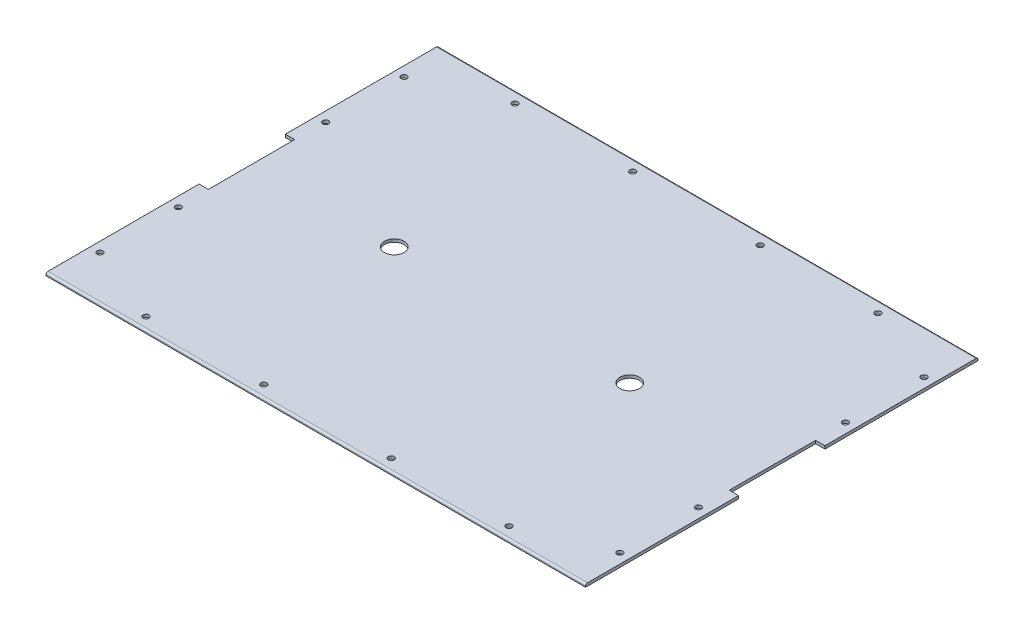
ISO-10303-21;
HEADER;
FILE_DESCRIPTION(('STEP AP214'),'2;1');
FILE_NAME('part.step','',(''),(''),'','','');
FILE_SCHEMA(('AUTOMOTIVE_DESIGN { 1 0 10303 214 1 1 1 1 }'));
ENDSEC;
DATA;
#1=APPLICATION_CONTEXT('core data for automotive mechanical design processes');
#2=APPLICATION_PROTOCOL_DEFINITION('international standard','automotive_design',2000,#1);
#3=PRODUCT_CONTEXT('',#1,'mechanical');
#4=PRODUCT('Part','Part','',(#3));
#5=PRODUCT_RELATED_PRODUCT_CATEGORY('part','',(#4));
#6=PRODUCT_DEFINITION_FORMATION('','',#4);
#7=PRODUCT_DEFINITION_CONTEXT('part definition',#1,'design');
#8=PRODUCT_DEFINITION('design','',#6,#7);
#9=PRODUCT_DEFINITION_SHAPE('','',#8);
#10=(LENGTH_UNIT() NAMED_UNIT(*) SI_UNIT(.MILLI.,.METRE.));
#11=(NAMED_UNIT(*) PLANE_ANGLE_UNIT() SI_UNIT($,.RADIAN.));
#12=(NAMED_UNIT(*) SI_UNIT($,.STERADIAN.) SOLID_ANGLE_UNIT());
#13=UNCERTAINTY_MEASURE_WITH_UNIT(LENGTH_MEASURE(1.E-05),#10,'distance_accuracy_value','');
#14=(GEOMETRIC_REPRESENTATION_CONTEXT(3) GLOBAL_UNCERTAINTY_ASSIGNED_CONTEXT((#13)) GLOBAL_UNIT_ASSIGNED_CONTEXT((#10,
#11,#12)) REPRESENTATION_CONTEXT('',''));
#15=CARTESIAN_POINT('',(0.,0.,0.));
#16=DIRECTION('',(0.,0.,1.));
#17=DIRECTION('',(1.,0.,0.));
#18=AXIS2_PLACEMENT_3D('',#15,#16,#17);
#19=CARTESIAN_POINT('',(0.,3.,-43.9999999999999));
#20=DIRECTION('',(0.,0.,1.));
#21=DIRECTION('',(1.,0.,0.));
#22=AXIS2_PLACEMENT_3D('',#19,#20,#21);
#23=PLANE('',#22);
#24=DIRECTION('',(-1.,0.,0.));
#25=VECTOR('',#24,1.);
#26=CARTESIAN_POINT('',(0.,0.,-43.9999999999999));
#27=LINE('',#26,#25);
#28=CARTESIAN_POINT('',(275.,0.,-43.9999999999999));
#29=VERTEX_POINT('',#28);
#30=CARTESIAN_POINT('',(265.5,0.,-43.9999999999999));
#31=VERTEX_POINT('',#30);
#32=EDGE_CURVE('E145',#29,#31,#27,.T.);
#33=ORIENTED_EDGE('',*,*,#32,.F.);
#34=DIRECTION('',(0.,-1.,0.));
#35=VECTOR('',#34,1.);
#36=CARTESIAN_POINT('',(275.,3.,-43.9999999999999));
#37=LINE('',#36,#35);
#38=CARTESIAN_POINT('',(275.,3.,-43.9999999999999));
#39=VERTEX_POINT('',#38);
#40=EDGE_CURVE('E140',#39,#29,#37,.T.);
#41=ORIENTED_EDGE('',*,*,#40,.F.);
#42=DIRECTION('',(-1.,0.,0.));
#43=VECTOR('',#42,1.);
#44=CARTESIAN_POINT('',(0.,3.,-43.9999999999999));
#45=LINE('',#44,#43);
#46=CARTESIAN_POINT('',(265.5,3.,-43.9999999999999));
#47=VERTEX_POINT('',#46);
#48=EDGE_CURVE('E142',#39,#47,#45,.T.);
#49=ORIENTED_EDGE('',*,*,#48,.T.);
#50=DIRECTION('',(0.,-1.,0.));
#51=VECTOR('',#50,1.);
#52=CARTESIAN_POINT('',(265.5,3.,-43.9999999999999));
#53=LINE('',#52,#51);
#54=EDGE_CURVE('E197',#47,#31,#53,.T.);
#55=ORIENTED_EDGE('',*,*,#54,.T.);
#56=EDGE_LOOP('',(#33,#41,#49,#55));
#57=FACE_BOUND('',#56,.T.);
#58=ADVANCED_FACE('F39',(#57),#23,.T.);
#59=CARTESIAN_POINT('',(275.,3.,1.95712392161486E-13));
#60=DIRECTION('',(-1.,0.,0.));
#61=DIRECTION('',(0.,0.,1.));
#62=AXIS2_PLACEMENT_3D('',#59,#60,#61);
#63=PLANE('',#62);
#64=DIRECTION('',(0.,-1.,0.));
#65=VECTOR('',#64,1.);
#66=CARTESIAN_POINT('',(275.,3.,-200.));
#67=LINE('',#66,#65);
#68=CARTESIAN_POINT('',(275.,1.,-200.));
#69=VERTEX_POINT('',#68);
#70=CARTESIAN_POINT('',(275.,0.,-200.));
#71=VERTEX_POINT('',#70);
#72=EDGE_CURVE('E149',#69,#71,#67,.T.);
#73=ORIENTED_EDGE('',*,*,#72,.F.);
#74=CARTESIAN_POINT('',(275.,1.,-198.));
#75=DIRECTION('',(-1.,0.,0.));
#76=DIRECTION('',(0.,0.,1.));
#77=AXIS2_PLACEMENT_3D('',#74,#75,#76);
#78=CIRCLE('',#77,2.);
#79=CARTESIAN_POINT('',(275.,3.,-198.));
#80=VERTEX_POINT('',#79);
#81=EDGE_CURVE('E61',#69,#80,#78,.F.);
#82=ORIENTED_EDGE('',*,*,#81,.T.);
#83=DIRECTION('',(0.,0.,-1.));
#84=VECTOR('',#83,1.);
#85=CARTESIAN_POINT('',(275.,3.,1.95712392161486E-13));
#86=LINE('',#85,#84);
#87=EDGE_CURVE('E151',#39,#80,#86,.T.);
#88=ORIENTED_EDGE('',*,*,#87,.F.);
#89=ORIENTED_EDGE('',*,*,#40,.T.);
#90=DIRECTION('',(0.,0.,-1.));
#91=VECTOR('',#90,1.);
#92=CARTESIAN_POINT('',(275.,0.,1.95712392161486E-13));
#93=LINE('',#92,#91);
#94=EDGE_CURVE('E241',#29,#71,#93,.T.);
#95=ORIENTED_EDGE('',*,*,#94,.T.);
#96=EDGE_LOOP('',(#73,#82,#88,#89,#95));
#97=FACE_BOUND('',#96,.T.);
#98=ADVANCED_FACE('F152',(#97),#63,.F.);
#99=CARTESIAN_POINT('',(0.,3.,-200.));
#100=DIRECTION('',(0.,0.,-1.));
#101=DIRECTION('',(-1.,0.,0.));
#102=AXIS2_PLACEMENT_3D('',#99,#100,#101);
#103=PLANE('',#102);
#104=DIRECTION('',(0.,-1.,0.));
#105=VECTOR('',#104,1.);
#106=CARTESIAN_POINT('',(-275.,3.,-200.));
#107=LINE('',#106,#105);
#108=CARTESIAN_POINT('',(-275.,1.,-200.));
#109=VERTEX_POINT('',#108);
#110=CARTESIAN_POINT('',(-275.,0.,-200.));
#111=VERTEX_POINT('',#110);
#112=EDGE_CURVE('E305',#109,#111,#107,.T.);
#113=ORIENTED_EDGE('',*,*,#112,.F.);
#114=DIRECTION('',(1.,0.,0.));
#115=VECTOR('',#114,1.);
#116=CARTESIAN_POINT('',(0.,1.,-200.));
#117=LINE('',#116,#115);
#118=EDGE_CURVE('E316',#109,#69,#117,.T.);
#119=ORIENTED_EDGE('',*,*,#118,.T.);
#120=ORIENTED_EDGE('',*,*,#72,.T.);
#121=DIRECTION('',(1.,0.,0.));
#122=VECTOR('',#121,1.);
#123=CARTESIAN_POINT('',(0.,0.,-200.));
#124=LINE('',#123,#122);
#125=EDGE_CURVE('E243',#111,#71,#124,.T.);
#126=ORIENTED_EDGE('',*,*,#125,.F.);
#127=EDGE_LOOP('',(#113,#119,#120,#126));
#128=FACE_BOUND('',#127,.T.);
#129=ADVANCED_FACE('F322',(#128),#103,.T.);
#130=CARTESIAN_POINT('',(-275.,3.,0.));
#131=DIRECTION('',(-1.,0.,0.));
#132=DIRECTION('',(0.,0.,1.));
#133=AXIS2_PLACEMENT_3D('',#130,#131,#132);
#134=PLANE('',#133);
#135=DIRECTION('',(0.,0.,-1.));
#136=VECTOR('',#135,1.);
#137=CARTESIAN_POINT('',(-275.,3.,0.));
#138=LINE('',#137,#136);
#139=CARTESIAN_POINT('',(-275.,3.,-43.9999999999999));
#140=VERTEX_POINT('',#139);
#141=CARTESIAN_POINT('',(-275.,3.,-198.));
#142=VERTEX_POINT('',#141);
#143=EDGE_CURVE('E153',#140,#142,#138,.T.);
#144=ORIENTED_EDGE('',*,*,#143,.T.);
#145=CARTESIAN_POINT('',(-275.,1.,-198.));
#146=DIRECTION('',(-1.,0.,0.));
#147=DIRECTION('',(0.,0.,1.));
#148=AXIS2_PLACEMENT_3D('',#145,#146,#147);
#149=CIRCLE('',#148,2.);
#150=EDGE_CURVE('E11',#142,#109,#149,.T.);
#151=ORIENTED_EDGE('',*,*,#150,.T.);
#152=ORIENTED_EDGE('',*,*,#112,.T.);
#153=DIRECTION('',(0.,0.,-1.));
#154=VECTOR('',#153,1.);
#155=CARTESIAN_POINT('',(-275.,0.,0.));
#156=LINE('',#155,#154);
#157=CARTESIAN_POINT('',(-275.,0.,-43.9999999999999));
#158=VERTEX_POINT('',#157);
#159=EDGE_CURVE('E246',#158,#111,#156,.T.);
#160=ORIENTED_EDGE('',*,*,#159,.F.);
#161=DIRECTION('',(0.,-1.,0.));
#162=VECTOR('',#161,1.);
#163=CARTESIAN_POINT('',(-275.,3.,-43.9999999999999));
#164=LINE('',#163,#162);
#165=EDGE_CURVE('E303',#140,#158,#164,.T.);
#166=ORIENTED_EDGE('',*,*,#165,.F.);
#167=EDGE_LOOP('',(#144,#151,#152,#160,#166));
#168=FACE_BOUND('',#167,.T.);
#169=ADVANCED_FACE('F332',(#168),#134,.T.);
#170=CARTESIAN_POINT('',(0.,3.,-43.9999999999999));
#171=DIRECTION('',(0.,0.,-1.));
#172=DIRECTION('',(-1.,0.,0.));
#173=AXIS2_PLACEMENT_3D('',#170,#171,#172);
#174=PLANE('',#173);
#175=DIRECTION('',(1.,0.,0.));
#176=VECTOR('',#175,1.);
#177=CARTESIAN_POINT('',(0.,0.,-43.9999999999999));
#178=LINE('',#177,#176);
#179=CARTESIAN_POINT('',(-265.5,0.,-43.9999999999999));
#180=VERTEX_POINT('',#179);
#181=EDGE_CURVE('E249',#158,#180,#178,.T.);
#182=ORIENTED_EDGE('',*,*,#181,.T.);
#183=DIRECTION('',(0.,-1.,0.));
#184=VECTOR('',#183,1.);
#185=CARTESIAN_POINT('',(-265.5,3.,-43.9999999999999));
#186=LINE('',#185,#184);
#187=CARTESIAN_POINT('',(-265.5,3.,-43.9999999999999));
#188=VERTEX_POINT('',#187);
#189=EDGE_CURVE('E300',#188,#180,#186,.T.);
#190=ORIENTED_EDGE('',*,*,#189,.F.);
#191=DIRECTION('',(1.,0.,0.));
#192=VECTOR('',#191,1.);
#193=CARTESIAN_POINT('',(0.,3.,-43.9999999999999));
#194=LINE('',#193,#192);
#195=EDGE_CURVE('E168',#140,#188,#194,.T.);
#196=ORIENTED_EDGE('',*,*,#195,.F.);
#197=ORIENTED_EDGE('',*,*,#165,.T.);
#198=EDGE_LOOP('',(#182,#190,#196,#197));
#199=FACE_BOUND('',#198,.T.);
#200=ADVANCED_FACE('F500',(#199),#174,.F.);
#201=CARTESIAN_POINT('',(-265.5,3.,1.67479666498852E-13));
#202=DIRECTION('',(1.,0.,0.));
#203=DIRECTION('',(0.,0.,-1.));
#204=AXIS2_PLACEMENT_3D('',#201,#202,#203);
#205=PLANE('',#204);
#206=DIRECTION('',(0.,0.,1.));
#207=VECTOR('',#206,1.);
#208=CARTESIAN_POINT('',(-265.5,0.,1.67479666498852E-13));
#209=LINE('',#208,#207);
#210=CARTESIAN_POINT('',(-265.5,0.,44.0000000000001));
#211=VERTEX_POINT('',#210);
#212=EDGE_CURVE('E252',#180,#211,#209,.T.);
#213=ORIENTED_EDGE('',*,*,#212,.T.);
#214=DIRECTION('',(0.,-1.,0.));
#215=VECTOR('',#214,1.);
#216=CARTESIAN_POINT('',(-265.5,3.,44.0000000000001));
#217=LINE('',#216,#215);
#218=CARTESIAN_POINT('',(-265.5,3.,44.0000000000001));
#219=VERTEX_POINT('',#218);
#220=EDGE_CURVE('E297',#219,#211,#217,.T.);
#221=ORIENTED_EDGE('',*,*,#220,.F.);
#222=DIRECTION('',(0.,0.,1.));
#223=VECTOR('',#222,1.);
#224=CARTESIAN_POINT('',(-265.5,3.,1.67479666498852E-13));
#225=LINE('',#224,#223);
#226=EDGE_CURVE('E171',#188,#219,#225,.T.);
#227=ORIENTED_EDGE('',*,*,#226,.F.);
#228=ORIENTED_EDGE('',*,*,#189,.T.);
#229=EDGE_LOOP('',(#213,#221,#227,#228));
#230=FACE_BOUND('',#229,.T.);
#231=ADVANCED_FACE('F496',(#230),#205,.F.);
#232=CARTESIAN_POINT('',(0.,3.,44.0000000000001));
#233=DIRECTION('',(0.,0.,1.));
#234=DIRECTION('',(1.,0.,0.));
#235=AXIS2_PLACEMENT_3D('',#232,#233,#234);
#236=PLANE('',#235);
#237=DIRECTION('',(-1.,0.,0.));
#238=VECTOR('',#237,1.);
#239=CARTESIAN_POINT('',(0.,0.,44.0000000000001));
#240=LINE('',#239,#238);
#241=CARTESIAN_POINT('',(-275.,0.,44.0000000000001));
#242=VERTEX_POINT('',#241);
#243=EDGE_CURVE('E255',#211,#242,#240,.T.);
#244=ORIENTED_EDGE('',*,*,#243,.T.);
#245=DIRECTION('',(0.,-1.,0.));
#246=VECTOR('',#245,1.);
#247=CARTESIAN_POINT('',(-275.,3.,44.0000000000001));
#248=LINE('',#247,#246);
#249=CARTESIAN_POINT('',(-275.,3.,44.0000000000001));
#250=VERTEX_POINT('',#249);
#251=EDGE_CURVE('E295',#250,#242,#248,.T.);
#252=ORIENTED_EDGE('',*,*,#251,.F.);
#253=DIRECTION('',(-1.,0.,0.));
#254=VECTOR('',#253,1.);
#255=CARTESIAN_POINT('',(0.,3.,44.0000000000001));
#256=LINE('',#255,#254);
#257=EDGE_CURVE('E174',#219,#250,#256,.T.);
#258=ORIENTED_EDGE('',*,*,#257,.F.);
#259=ORIENTED_EDGE('',*,*,#220,.T.);
#260=EDGE_LOOP('',(#244,#252,#258,#259));
#261=FACE_BOUND('',#260,.T.);
#262=ADVANCED_FACE('F492',(#261),#236,.F.);
#263=CARTESIAN_POINT('',(-275.,3.,0.));
#264=DIRECTION('',(-1.,0.,0.));
#265=DIRECTION('',(0.,0.,1.));
#266=AXIS2_PLACEMENT_3D('',#263,#264,#265);
#267=PLANE('',#266);
#268=DIRECTION('',(0.,-1.,0.));
#269=VECTOR('',#268,1.);
#270=CARTESIAN_POINT('',(-275.,3.,200.));
#271=LINE('',#270,#269);
#272=CARTESIAN_POINT('',(-275.,1.,200.));
#273=VERTEX_POINT('',#272);
#274=CARTESIAN_POINT('',(-275.,0.,200.));
#275=VERTEX_POINT('',#274);
#276=EDGE_CURVE('E293',#273,#275,#271,.T.);
#277=ORIENTED_EDGE('',*,*,#276,.F.);
#278=CARTESIAN_POINT('',(-275.,1.,198.));
#279=DIRECTION('',(-1.,0.,0.));
#280=DIRECTION('',(0.,0.,1.));
#281=AXIS2_PLACEMENT_3D('',#278,#279,#280);
#282=CIRCLE('',#281,2.);
#283=CARTESIAN_POINT('',(-275.,3.,198.));
#284=VERTEX_POINT('',#283);
#285=EDGE_CURVE('E314',#273,#284,#282,.T.);
#286=ORIENTED_EDGE('',*,*,#285,.T.);
#287=DIRECTION('',(0.,0.,-1.));
#288=VECTOR('',#287,1.);
#289=CARTESIAN_POINT('',(-275.,3.,0.));
#290=LINE('',#289,#288);
#291=EDGE_CURVE('E177',#284,#250,#290,.T.);
#292=ORIENTED_EDGE('',*,*,#291,.T.);
#293=ORIENTED_EDGE('',*,*,#251,.T.);
#294=DIRECTION('',(0.,0.,-1.));
#295=VECTOR('',#294,1.);
#296=CARTESIAN_POINT('',(-275.,0.,0.));
#297=LINE('',#296,#295);
#298=EDGE_CURVE('E258',#275,#242,#297,.T.);
#299=ORIENTED_EDGE('',*,*,#298,.F.);
#300=EDGE_LOOP('',(#277,#286,#292,#293,#299));
#301=FACE_BOUND('',#300,.T.);
#302=ADVANCED_FACE('F488',(#301),#267,.T.);
#303=CARTESIAN_POINT('',(0.,3.,200.));
#304=DIRECTION('',(0.,0.,-1.));
#305=DIRECTION('',(-1.,0.,0.));
#306=AXIS2_PLACEMENT_3D('',#303,#304,#305);
#307=PLANE('',#306);
#308=DIRECTION('',(0.,-1.,0.));
#309=VECTOR('',#308,1.);
#310=CARTESIAN_POINT('',(275.,3.,200.));
#311=LINE('',#310,#309);
#312=CARTESIAN_POINT('',(275.,1.,200.));
#313=VERTEX_POINT('',#312);
#314=CARTESIAN_POINT('',(275.,0.,200.));
#315=VERTEX_POINT('',#314);
#316=EDGE_CURVE('E291',#313,#315,#311,.T.);
#317=ORIENTED_EDGE('',*,*,#316,.F.);
#318=DIRECTION('',(1.,0.,0.));
#319=VECTOR('',#318,1.);
#320=CARTESIAN_POINT('',(-275.,1.,200.));
#321=LINE('',#320,#319);
#322=EDGE_CURVE('E312',#313,#273,#321,.F.);
#323=ORIENTED_EDGE('',*,*,#322,.T.);
#324=ORIENTED_EDGE('',*,*,#276,.T.);
#325=DIRECTION('',(1.,0.,0.));
#326=VECTOR('',#325,1.);
#327=CARTESIAN_POINT('',(0.,0.,200.));
#328=LINE('',#327,#326);
#329=EDGE_CURVE('E261',#275,#315,#328,.T.);
#330=ORIENTED_EDGE('',*,*,#329,.T.);
#331=EDGE_LOOP('',(#317,#323,#324,#330));
#332=FACE_BOUND('',#331,.T.);
#333=ADVANCED_FACE('F484',(#332),#307,.F.);
#334=CARTESIAN_POINT('',(275.,3.,-1.95712392161486E-13));
#335=DIRECTION('',(-1.,0.,0.));
#336=DIRECTION('',(0.,0.,1.));
#337=AXIS2_PLACEMENT_3D('',#334,#335,#336);
#338=PLANE('',#337);
#339=DIRECTION('',(0.,0.,-1.));
#340=VECTOR('',#339,1.);
#341=CARTESIAN_POINT('',(275.,3.,-1.95712392161486E-13));
#342=LINE('',#341,#340);
#343=CARTESIAN_POINT('',(275.,3.,198.));
#344=VERTEX_POINT('',#343);
#345=CARTESIAN_POINT('',(275.,3.,44.0000000000001));
#346=VERTEX_POINT('',#345);
#347=EDGE_CURVE('E179',#344,#346,#342,.T.);
#348=ORIENTED_EDGE('',*,*,#347,.F.);
#349=CARTESIAN_POINT('',(275.,1.,198.));
#350=DIRECTION('',(-1.,0.,0.));
#351=DIRECTION('',(0.,0.,1.));
#352=AXIS2_PLACEMENT_3D('',#349,#350,#351);
#353=CIRCLE('',#352,2.);
#354=EDGE_CURVE('E310',#344,#313,#353,.F.);
#355=ORIENTED_EDGE('',*,*,#354,.T.);
#356=ORIENTED_EDGE('',*,*,#316,.T.);
#357=DIRECTION('',(0.,0.,-1.));
#358=VECTOR('',#357,1.);
#359=CARTESIAN_POINT('',(275.,0.,-1.95712392161486E-13));
#360=LINE('',#359,#358);
#361=CARTESIAN_POINT('',(275.,0.,44.0000000000001));
#362=VERTEX_POINT('',#361);
#363=EDGE_CURVE('E264',#315,#362,#360,.T.);
#364=ORIENTED_EDGE('',*,*,#363,.T.);
#365=DIRECTION('',(0.,-1.,0.));
#366=VECTOR('',#365,1.);
#367=CARTESIAN_POINT('',(275.,3.,44.0000000000001));
#368=LINE('',#367,#366);
#369=EDGE_CURVE('E289',#346,#362,#368,.T.);
#370=ORIENTED_EDGE('',*,*,#369,.F.);
#371=EDGE_LOOP('',(#348,#355,#356,#364,#370));
#372=FACE_BOUND('',#371,.T.);
#373=ADVANCED_FACE('F480',(#372),#338,.F.);
#374=CARTESIAN_POINT('',(0.,3.,44.0000000000001));
#375=DIRECTION('',(0.,0.,-1.));
#376=DIRECTION('',(-1.,0.,0.));
#377=AXIS2_PLACEMENT_3D('',#374,#375,#376);
#378=PLANE('',#377);
#379=DIRECTION('',(1.,0.,0.));
#380=VECTOR('',#379,1.);
#381=CARTESIAN_POINT('',(0.,0.,44.0000000000001));
#382=LINE('',#381,#380);
#383=CARTESIAN_POINT('',(265.5,0.,44.0000000000001));
#384=VERTEX_POINT('',#383);
#385=EDGE_CURVE('E267',#384,#362,#382,.T.);
#386=ORIENTED_EDGE('',*,*,#385,.F.);
#387=DIRECTION('',(0.,-1.,0.));
#388=VECTOR('',#387,1.);
#389=CARTESIAN_POINT('',(265.5,3.,44.0000000000001));
#390=LINE('',#389,#388);
#391=CARTESIAN_POINT('',(265.5,3.,44.0000000000001));
#392=VERTEX_POINT('',#391);
#393=EDGE_CURVE('E287',#392,#384,#390,.T.);
#394=ORIENTED_EDGE('',*,*,#393,.F.);
#395=DIRECTION('',(1.,0.,0.));
#396=VECTOR('',#395,1.);
#397=CARTESIAN_POINT('',(0.,3.,44.0000000000001));
#398=LINE('',#397,#396);
#399=EDGE_CURVE('E181',#392,#346,#398,.T.);
#400=ORIENTED_EDGE('',*,*,#399,.T.);
#401=ORIENTED_EDGE('',*,*,#369,.T.);
#402=EDGE_LOOP('',(#386,#394,#400,#401));
#403=FACE_BOUND('',#402,.T.);
#404=ADVANCED_FACE('F466',(#403),#378,.T.);
#405=CARTESIAN_POINT('',(185.,3.,188.));
#406=DIRECTION('',(0.,-1.,0.));
#407=DIRECTION('',(0.,0.,-1.));
#408=AXIS2_PLACEMENT_3D('',#405,#406,#407);
#409=CYLINDRICAL_SURFACE('',#408,2.99999999999999);
#410=CARTESIAN_POINT('',(185.,3.,188.));
#411=DIRECTION('',(0.,1.,0.));
#412=DIRECTION('',(0.,0.,1.));
#413=AXIS2_PLACEMENT_3D('',#410,#411,#412);
#414=CIRCLE('',#413,2.99999999999999);
#415=CARTESIAN_POINT('',(185.,3.,191.));
#416=VERTEX_POINT('',#415);
#417=EDGE_CURVE('E191',#416,#416,#414,.F.);
#418=ORIENTED_EDGE('',*,*,#417,.F.);
#419=EDGE_LOOP('',(#418));
#420=FACE_BOUND('',#419,.T.);
#421=CARTESIAN_POINT('',(185.,0.,188.));
#422=DIRECTION('',(0.,1.,0.));
#423=DIRECTION('',(0.,0.,1.));
#424=AXIS2_PLACEMENT_3D('',#421,#422,#423);
#425=CIRCLE('',#424,2.99999999999999);
#426=CARTESIAN_POINT('',(185.,0.,191.));
#427=VERTEX_POINT('',#426);
#428=EDGE_CURVE('E279',#427,#427,#425,.F.);
#429=ORIENTED_EDGE('',*,*,#428,.T.);
#430=EDGE_LOOP('',(#429));
#431=FACE_BOUND('',#430,.T.);
#432=ADVANCED_FACE('F462',(#420,#431),#409,.F.);
#433=CARTESIAN_POINT('',(-265.,3.,-75.));
#434=DIRECTION('',(0.,-1.,0.));
#435=DIRECTION('',(0.,0.,-1.));
#436=AXIS2_PLACEMENT_3D('',#433,#434,#435);
#437=CYLINDRICAL_SURFACE('',#436,2.99999999999999);
#438=CARTESIAN_POINT('',(-265.,3.,-75.));
#439=DIRECTION('',(0.,1.,0.));
#440=DIRECTION('',(0.,0.,1.));
#441=AXIS2_PLACEMENT_3D('',#438,#439,#440);
#442=CIRCLE('',#441,2.99999999999999);
#443=CARTESIAN_POINT('',(-265.,3.,-72.));
#444=VERTEX_POINT('',#443);
#445=EDGE_CURVE('E188',#444,#444,#442,.F.);
#446=ORIENTED_EDGE('',*,*,#445,.F.);
#447=EDGE_LOOP('',(#446));
#448=FACE_BOUND('',#447,.T.);
#449=CARTESIAN_POINT('',(-265.,0.,-75.));
#450=DIRECTION('',(0.,1.,0.));
#451=DIRECTION('',(0.,0.,1.));
#452=AXIS2_PLACEMENT_3D('',#449,#450,#451);
#453=CIRCLE('',#452,2.99999999999999);
#454=CARTESIAN_POINT('',(-265.,0.,-72.));
#455=VERTEX_POINT('',#454);
#456=EDGE_CURVE('E276',#455,#455,#453,.F.);
#457=ORIENTED_EDGE('',*,*,#456,.T.);
#458=EDGE_LOOP('',(#457));
#459=FACE_BOUND('',#458,.T.);
#460=ADVANCED_FACE('F465',(#448,#459),#437,.F.);
#461=CARTESIAN_POINT('',(-185.,3.,-188.));
#462=DIRECTION('',(0.,-1.,0.));
#463=DIRECTION('',(0.,0.,-1.));
#464=AXIS2_PLACEMENT_3D('',#461,#462,#463);
#465=CYLINDRICAL_SURFACE('',#464,2.99999999999999);
#466=CARTESIAN_POINT('',(-185.,3.,-188.));
#467=DIRECTION('',(0.,1.,0.));
#468=DIRECTION('',(0.,0.,1.));
#469=AXIS2_PLACEMENT_3D('',#466,#467,#468);
#470=CIRCLE('',#469,2.99999999999999);
#471=CARTESIAN_POINT('',(-185.,3.,-185.));
#472=VERTEX_POINT('',#471);
#473=EDGE_CURVE('E185',#472,#472,#470,.F.);
#474=ORIENTED_EDGE('',*,*,#473,.F.);
#475=EDGE_LOOP('',(#474));
#476=FACE_BOUND('',#475,.T.);
#477=CARTESIAN_POINT('',(-185.,0.,-188.));
#478=DIRECTION('',(0.,1.,0.));
#479=DIRECTION('',(0.,0.,1.));
#480=AXIS2_PLACEMENT_3D('',#477,#478,#479);
#481=CIRCLE('',#480,2.99999999999999);
#482=CARTESIAN_POINT('',(-185.,0.,-185.));
#483=VERTEX_POINT('',#482);
#484=EDGE_CURVE('E273',#483,#483,#481,.F.);
#485=ORIENTED_EDGE('',*,*,#484,.T.);
#486=EDGE_LOOP('',(#485));
#487=FACE_BOUND('',#486,.T.);
#488=ADVANCED_FACE('F470',(#476,#487),#465,.F.);
#489=CARTESIAN_POINT('',(265.5,3.,1.67479666498852E-13));
#490=DIRECTION('',(1.,0.,0.));
#491=DIRECTION('',(0.,0.,-1.));
#492=AXIS2_PLACEMENT_3D('',#489,#490,#491);
#493=PLANE('',#492);
#494=DIRECTION('',(0.,0.,1.));
#495=VECTOR('',#494,1.);
#496=CARTESIAN_POINT('',(265.5,0.,1.67479666498852E-13));
#497=LINE('',#496,#495);
#498=EDGE_CURVE('E270',#31,#384,#497,.T.);
#499=ORIENTED_EDGE('',*,*,#498,.F.);
#500=ORIENTED_EDGE('',*,*,#54,.F.);
#501=DIRECTION('',(0.,0.,1.));
#502=VECTOR('',#501,1.);
#503=CARTESIAN_POINT('',(265.5,3.,1.67479666498852E-13));
#504=LINE('',#503,#502);
#505=EDGE_CURVE('E159',#47,#392,#504,.T.);
#506=ORIENTED_EDGE('',*,*,#505,.T.);
#507=ORIENTED_EDGE('',*,*,#393,.T.);
#508=EDGE_LOOP('',(#499,#500,#506,#507));
#509=FACE_BOUND('',#508,.T.);
#510=ADVANCED_FACE('F352',(#509),#493,.T.);
#511=CARTESIAN_POINT('',(-265.,3.,75.));
#512=DIRECTION('',(0.,-1.,0.));
#513=DIRECTION('',(0.,0.,-1.));
#514=AXIS2_PLACEMENT_3D('',#511,#512,#513);
#515=CYLINDRICAL_SURFACE('',#514,2.99999999999999);
#516=CARTESIAN_POINT('',(-265.,3.,75.));
#517=DIRECTION('',(0.,1.,0.));
#518=DIRECTION('',(0.,0.,1.));
#519=AXIS2_PLACEMENT_3D('',#516,#517,#518);
#520=CIRCLE('',#519,2.99999999999999);
#521=CARTESIAN_POINT('',(-265.,3.,78.));
#522=VERTEX_POINT('',#521);
#523=EDGE_CURVE('E160',#522,#522,#520,.T.);
#524=ORIENTED_EDGE('',*,*,#523,.T.);
#525=EDGE_LOOP('',(#524));
#526=FACE_BOUND('',#525,.T.);
#527=CARTESIAN_POINT('',(-265.,0.,75.));
#528=DIRECTION('',(0.,1.,0.));
#529=DIRECTION('',(0.,0.,1.));
#530=AXIS2_PLACEMENT_3D('',#527,#528,#529);
#531=CIRCLE('',#530,2.99999999999999);
#532=CARTESIAN_POINT('',(-265.,0.,78.));
#533=VERTEX_POINT('',#532);
#534=EDGE_CURVE('E237',#533,#533,#531,.T.);
#535=ORIENTED_EDGE('',*,*,#534,.F.);
#536=EDGE_LOOP('',(#535));
#537=FACE_BOUND('',#536,.T.);
#538=ADVANCED_FACE('F348',(#526,#537),#515,.F.);
#539=CARTESIAN_POINT('',(-265.,3.,155.));
#540=DIRECTION('',(0.,-1.,0.));
#541=DIRECTION('',(0.,0.,-1.));
#542=AXIS2_PLACEMENT_3D('',#539,#540,#541);
#543=CYLINDRICAL_SURFACE('',#542,2.99999999999999);
#544=CARTESIAN_POINT('',(-265.,3.,155.));
#545=DIRECTION('',(0.,1.,0.));
#546=DIRECTION('',(0.,0.,1.));
#547=AXIS2_PLACEMENT_3D('',#544,#545,#546);
#548=CIRCLE('',#547,2.99999999999999);
#549=CARTESIAN_POINT('',(-265.,3.,158.));
#550=VERTEX_POINT('',#549);
#551=EDGE_CURVE('E163',#550,#550,#548,.T.);
#552=ORIENTED_EDGE('',*,*,#551,.T.);
#553=EDGE_LOOP('',(#552));
#554=FACE_BOUND('',#553,.T.);
#555=CARTESIAN_POINT('',(-265.,0.,155.));
#556=DIRECTION('',(0.,1.,0.));
#557=DIRECTION('',(0.,0.,1.));
#558=AXIS2_PLACEMENT_3D('',#555,#556,#557);
#559=CIRCLE('',#558,2.99999999999999);
#560=CARTESIAN_POINT('',(-265.,0.,158.));
#561=VERTEX_POINT('',#560);
#562=EDGE_CURVE('E234',#561,#561,#559,.T.);
#563=ORIENTED_EDGE('',*,*,#562,.F.);
#564=EDGE_LOOP('',(#563));
#565=FACE_BOUND('',#564,.T.);
#566=ADVANCED_FACE('F351',(#554,#565),#543,.F.);
#567=CARTESIAN_POINT('',(-185.,3.,188.));
#568=DIRECTION('',(0.,-1.,0.));
#569=DIRECTION('',(0.,0.,-1.));
#570=AXIS2_PLACEMENT_3D('',#567,#568,#569);
#571=CYLINDRICAL_SURFACE('',#570,2.99999999999999);
#572=CARTESIAN_POINT('',(-185.,3.,188.));
#573=DIRECTION('',(0.,1.,0.));
#574=DIRECTION('',(0.,0.,1.));
#575=AXIS2_PLACEMENT_3D('',#572,#573,#574);
#576=CIRCLE('',#575,2.99999999999999);
#577=CARTESIAN_POINT('',(-185.,3.,191.));
#578=VERTEX_POINT('',#577);
#579=EDGE_CURVE('E835',#578,#578,#576,.T.);
#580=ORIENTED_EDGE('',*,*,#579,.T.);
#581=EDGE_LOOP('',(#580));
#582=FACE_BOUND('',#581,.T.);
#583=CARTESIAN_POINT('',(-185.,0.,188.));
#584=DIRECTION('',(0.,1.,0.));
#585=DIRECTION('',(0.,0.,1.));
#586=AXIS2_PLACEMENT_3D('',#583,#584,#585);
#587=CIRCLE('',#586,2.99999999999999);
#588=CARTESIAN_POINT('',(-185.,0.,191.));
#589=VERTEX_POINT('',#588);
#590=EDGE_CURVE('E231',#589,#589,#587,.T.);
#591=ORIENTED_EDGE('',*,*,#590,.F.);
#592=EDGE_LOOP('',(#591));
#593=FACE_BOUND('',#592,.T.);
#594=ADVANCED_FACE('F356',(#582,#593),#571,.F.);
#595=CARTESIAN_POINT('',(-65.0000000000001,3.,188.));
#596=DIRECTION('',(0.,-1.,0.));
#597=DIRECTION('',(0.,0.,-1.));
#598=AXIS2_PLACEMENT_3D('',#595,#596,#597);
#599=CYLINDRICAL_SURFACE('',#598,3.);
#600=CARTESIAN_POINT('',(-65.0000000000001,3.,188.));
#601=DIRECTION('',(0.,1.,0.));
#602=DIRECTION('',(0.,0.,1.));
#603=AXIS2_PLACEMENT_3D('',#600,#601,#602);
#604=CIRCLE('',#603,3.);
#605=CARTESIAN_POINT('',(-65.0000000000001,3.,191.));
#606=VERTEX_POINT('',#605);
#607=EDGE_CURVE('E831',#606,#606,#604,.T.);
#608=ORIENTED_EDGE('',*,*,#607,.T.);
#609=EDGE_LOOP('',(#608));
#610=FACE_BOUND('',#609,.T.);
#611=CARTESIAN_POINT('',(-65.0000000000001,0.,188.));
#612=DIRECTION('',(0.,1.,0.));
#613=DIRECTION('',(0.,0.,1.));
#614=AXIS2_PLACEMENT_3D('',#611,#612,#613);
#615=CIRCLE('',#614,3.);
#616=CARTESIAN_POINT('',(-65.0000000000001,0.,191.));
#617=VERTEX_POINT('',#616);
#618=EDGE_CURVE('E228',#617,#617,#615,.T.);
#619=ORIENTED_EDGE('',*,*,#618,.F.);
#620=EDGE_LOOP('',(#619));
#621=FACE_BOUND('',#620,.T.);
#622=ADVANCED_FACE('F360',(#610,#621),#599,.F.);
#623=CARTESIAN_POINT('',(-65.0000000000001,3.,-188.));
#624=DIRECTION('',(0.,-1.,0.));
#625=DIRECTION('',(0.,0.,-1.));
#626=AXIS2_PLACEMENT_3D('',#623,#624,#625);
#627=CYLINDRICAL_SURFACE('',#626,3.);
#628=CARTESIAN_POINT('',(-65.0000000000001,3.,-188.));
#629=DIRECTION('',(0.,1.,0.));
#630=DIRECTION('',(0.,0.,1.));
#631=AXIS2_PLACEMENT_3D('',#628,#629,#630);
#632=CIRCLE('',#631,3.);
#633=CARTESIAN_POINT('',(-65.0000000000001,3.,-185.));
#634=VERTEX_POINT('',#633);
#635=EDGE_CURVE('E827',#634,#634,#632,.F.);
#636=ORIENTED_EDGE('',*,*,#635,.F.);
#637=EDGE_LOOP('',(#636));
#638=FACE_BOUND('',#637,.T.);
#639=CARTESIAN_POINT('',(-65.0000000000001,0.,-188.));
#640=DIRECTION('',(0.,1.,0.));
#641=DIRECTION('',(0.,0.,1.));
#642=AXIS2_PLACEMENT_3D('',#639,#640,#641);
#643=CIRCLE('',#642,3.);
#644=CARTESIAN_POINT('',(-65.0000000000001,0.,-185.));
#645=VERTEX_POINT('',#644);
#646=EDGE_CURVE('E225',#645,#645,#643,.F.);
#647=ORIENTED_EDGE('',*,*,#646,.T.);
#648=EDGE_LOOP('',(#647));
#649=FACE_BOUND('',#648,.T.);
#650=ADVANCED_FACE('F364',(#638,#649),#627,.F.);
#651=CARTESIAN_POINT('',(-265.,3.,-155.));
#652=DIRECTION('',(0.,-1.,0.));
#653=DIRECTION('',(0.,0.,-1.));
#654=AXIS2_PLACEMENT_3D('',#651,#652,#653);
#655=CYLINDRICAL_SURFACE('',#654,2.99999999999999);
#656=CARTESIAN_POINT('',(-265.,3.,-155.));
#657=DIRECTION('',(0.,1.,0.));
#658=DIRECTION('',(0.,0.,1.));
#659=AXIS2_PLACEMENT_3D('',#656,#657,#658);
#660=CIRCLE('',#659,2.99999999999999);
#661=CARTESIAN_POINT('',(-265.,3.,-152.));
#662=VERTEX_POINT('',#661);
#663=EDGE_CURVE('E823',#662,#662,#660,.F.);
#664=ORIENTED_EDGE('',*,*,#663,.F.);
#665=EDGE_LOOP('',(#664));
#666=FACE_BOUND('',#665,.T.);
#667=CARTESIAN_POINT('',(-265.,0.,-155.));
#668=DIRECTION('',(0.,1.,0.));
#669=DIRECTION('',(0.,0.,1.));
#670=AXIS2_PLACEMENT_3D('',#667,#668,#669);
#671=CIRCLE('',#670,2.99999999999999);
#672=CARTESIAN_POINT('',(-265.,0.,-152.));
#673=VERTEX_POINT('',#672);
#674=EDGE_CURVE('E222',#673,#673,#671,.F.);
#675=ORIENTED_EDGE('',*,*,#674,.T.);
#676=EDGE_LOOP('',(#675));
#677=FACE_BOUND('',#676,.T.);
#678=ADVANCED_FACE('F368',(#666,#677),#655,.F.);
#679=CARTESIAN_POINT('',(265.,3.,-75.));
#680=DIRECTION('',(0.,-1.,0.));
#681=DIRECTION('',(0.,0.,-1.));
#682=AXIS2_PLACEMENT_3D('',#679,#680,#681);
#683=CYLINDRICAL_SURFACE('',#682,2.99999999999999);
#684=CARTESIAN_POINT('',(265.,3.,-75.));
#685=DIRECTION('',(0.,1.,0.));
#686=DIRECTION('',(0.,0.,1.));
#687=AXIS2_PLACEMENT_3D('',#684,#685,#686);
#688=CIRCLE('',#687,2.99999999999999);
#689=CARTESIAN_POINT('',(265.,3.,-72.));
#690=VERTEX_POINT('',#689);
#691=EDGE_CURVE('E819',#690,#690,#688,.T.);
#692=ORIENTED_EDGE('',*,*,#691,.T.);
#693=EDGE_LOOP('',(#692));
#694=FACE_BOUND('',#693,.T.);
#695=CARTESIAN_POINT('',(265.,0.,-75.));
#696=DIRECTION('',(0.,1.,0.));
#697=DIRECTION('',(0.,0.,1.));
#698=AXIS2_PLACEMENT_3D('',#695,#696,#697);
#699=CIRCLE('',#698,2.99999999999999);
#700=CARTESIAN_POINT('',(265.,0.,-72.));
#701=VERTEX_POINT('',#700);
#702=EDGE_CURVE('E219',#701,#701,#699,.T.);
#703=ORIENTED_EDGE('',*,*,#702,.F.);
#704=EDGE_LOOP('',(#703));
#705=FACE_BOUND('',#704,.T.);
#706=ADVANCED_FACE('F372',(#694,#705),#683,.F.);
#707=CARTESIAN_POINT('',(265.,3.,-155.));
#708=DIRECTION('',(0.,-1.,0.));
#709=DIRECTION('',(0.,0.,-1.));
#710=AXIS2_PLACEMENT_3D('',#707,#708,#709);
#711=CYLINDRICAL_SURFACE('',#710,2.99999999999999);
#712=CARTESIAN_POINT('',(265.,3.,-155.));
#713=DIRECTION('',(0.,1.,0.));
#714=DIRECTION('',(0.,0.,1.));
#715=AXIS2_PLACEMENT_3D('',#712,#713,#714);
#716=CIRCLE('',#715,2.99999999999999);
#717=CARTESIAN_POINT('',(265.,3.,-152.));
#718=VERTEX_POINT('',#717);
#719=EDGE_CURVE('E815',#718,#718,#716,.T.);
#720=ORIENTED_EDGE('',*,*,#719,.T.);
#721=EDGE_LOOP('',(#720));
#722=FACE_BOUND('',#721,.T.);
#723=CARTESIAN_POINT('',(265.,0.,-155.));
#724=DIRECTION('',(0.,1.,0.));
#725=DIRECTION('',(0.,0.,1.));
#726=AXIS2_PLACEMENT_3D('',#723,#724,#725);
#727=CIRCLE('',#726,2.99999999999999);
#728=CARTESIAN_POINT('',(265.,0.,-152.));
#729=VERTEX_POINT('',#728);
#730=EDGE_CURVE('E216',#729,#729,#727,.T.);
#731=ORIENTED_EDGE('',*,*,#730,.F.);
#732=EDGE_LOOP('',(#731));
#733=FACE_BOUND('',#732,.T.);
#734=ADVANCED_FACE('F376',(#722,#733),#711,.F.);
#735=CARTESIAN_POINT('',(185.,3.,-188.));
#736=DIRECTION('',(0.,-1.,0.));
#737=DIRECTION('',(0.,0.,-1.));
#738=AXIS2_PLACEMENT_3D('',#735,#736,#737);
#739=CYLINDRICAL_SURFACE('',#738,2.99999999999999);
#740=CARTESIAN_POINT('',(185.,3.,-188.));
#741=DIRECTION('',(0.,1.,0.));
#742=DIRECTION('',(0.,0.,1.));
#743=AXIS2_PLACEMENT_3D('',#740,#741,#742);
#744=CIRCLE('',#743,2.99999999999999);
#745=CARTESIAN_POINT('',(185.,3.,-185.));
#746=VERTEX_POINT('',#745);
#747=EDGE_CURVE('E811',#746,#746,#744,.T.);
#748=ORIENTED_EDGE('',*,*,#747,.T.);
#749=EDGE_LOOP('',(#748));
#750=FACE_BOUND('',#749,.T.);
#751=CARTESIAN_POINT('',(185.,0.,-188.));
#752=DIRECTION('',(0.,1.,0.));
#753=DIRECTION('',(0.,0.,1.));
#754=AXIS2_PLACEMENT_3D('',#751,#752,#753);
#755=CIRCLE('',#754,2.99999999999999);
#756=CARTESIAN_POINT('',(185.,0.,-185.));
#757=VERTEX_POINT('',#756);
#758=EDGE_CURVE('E213',#757,#757,#755,.T.);
#759=ORIENTED_EDGE('',*,*,#758,.F.);
#760=EDGE_LOOP('',(#759));
#761=FACE_BOUND('',#760,.T.);
#762=ADVANCED_FACE('F380',(#750,#761),#739,.F.);
#763=CARTESIAN_POINT('',(65.0000000000001,3.,-188.));
#764=DIRECTION('',(0.,-1.,0.));
#765=DIRECTION('',(0.,0.,-1.));
#766=AXIS2_PLACEMENT_3D('',#763,#764,#765);
#767=CYLINDRICAL_SURFACE('',#766,3.00000000000001);
#768=CARTESIAN_POINT('',(65.0000000000001,3.,-188.));
#769=DIRECTION('',(0.,1.,0.));
#770=DIRECTION('',(0.,0.,1.));
#771=AXIS2_PLACEMENT_3D('',#768,#769,#770);
#772=CIRCLE('',#771,3.00000000000001);
#773=CARTESIAN_POINT('',(65.0000000000001,3.,-185.));
#774=VERTEX_POINT('',#773);
#775=EDGE_CURVE('E807',#774,#774,#772,.T.);
#776=ORIENTED_EDGE('',*,*,#775,.T.);
#777=EDGE_LOOP('',(#776));
#778=FACE_BOUND('',#777,.T.);
#779=CARTESIAN_POINT('',(65.0000000000001,0.,-188.));
#780=DIRECTION('',(0.,1.,0.));
#781=DIRECTION('',(0.,0.,1.));
#782=AXIS2_PLACEMENT_3D('',#779,#780,#781);
#783=CIRCLE('',#782,3.00000000000001);
#784=CARTESIAN_POINT('',(65.0000000000001,0.,-185.));
#785=VERTEX_POINT('',#784);
#786=EDGE_CURVE('E210',#785,#785,#783,.T.);
#787=ORIENTED_EDGE('',*,*,#786,.F.);
#788=EDGE_LOOP('',(#787));
#789=FACE_BOUND('',#788,.T.);
#790=ADVANCED_FACE('F384',(#778,#789),#767,.F.);
#791=CARTESIAN_POINT('',(65.0000000000001,3.,188.));
#792=DIRECTION('',(0.,-1.,0.));
#793=DIRECTION('',(0.,0.,-1.));
#794=AXIS2_PLACEMENT_3D('',#791,#792,#793);
#795=CYLINDRICAL_SURFACE('',#794,3.00000000000001);
#796=CARTESIAN_POINT('',(65.0000000000001,3.,188.));
#797=DIRECTION('',(0.,1.,0.));
#798=DIRECTION('',(0.,0.,1.));
#799=AXIS2_PLACEMENT_3D('',#796,#797,#798);
#800=CIRCLE('',#799,3.00000000000001);
#801=CARTESIAN_POINT('',(65.0000000000001,3.,191.));
#802=VERTEX_POINT('',#801);
#803=EDGE_CURVE('E803',#802,#802,#800,.F.);
#804=ORIENTED_EDGE('',*,*,#803,.F.);
#805=EDGE_LOOP('',(#804));
#806=FACE_BOUND('',#805,.T.);
#807=CARTESIAN_POINT('',(65.0000000000001,0.,188.));
#808=DIRECTION('',(0.,1.,0.));
#809=DIRECTION('',(0.,0.,1.));
#810=AXIS2_PLACEMENT_3D('',#807,#808,#809);
#811=CIRCLE('',#810,3.00000000000001);
#812=CARTESIAN_POINT('',(65.0000000000001,0.,191.));
#813=VERTEX_POINT('',#812);
#814=EDGE_CURVE('E207',#813,#813,#811,.F.);
#815=ORIENTED_EDGE('',*,*,#814,.T.);
#816=EDGE_LOOP('',(#815));
#817=FACE_BOUND('',#816,.T.);
#818=ADVANCED_FACE('F388',(#806,#817),#795,.F.);
#819=CARTESIAN_POINT('',(265.,3.,155.));
#820=DIRECTION('',(0.,-1.,0.));
#821=DIRECTION('',(0.,0.,-1.));
#822=AXIS2_PLACEMENT_3D('',#819,#820,#821);
#823=CYLINDRICAL_SURFACE('',#822,2.99999999999999);
#824=CARTESIAN_POINT('',(265.,3.,155.));
#825=DIRECTION('',(0.,1.,0.));
#826=DIRECTION('',(0.,0.,1.));
#827=AXIS2_PLACEMENT_3D('',#824,#825,#826);
#828=CIRCLE('',#827,2.99999999999999);
#829=CARTESIAN_POINT('',(265.,3.,158.));
#830=VERTEX_POINT('',#829);
#831=EDGE_CURVE('E799',#830,#830,#828,.F.);
#832=ORIENTED_EDGE('',*,*,#831,.F.);
#833=EDGE_LOOP('',(#832));
#834=FACE_BOUND('',#833,.T.);
#835=CARTESIAN_POINT('',(265.,0.,155.));
#836=DIRECTION('',(0.,1.,0.));
#837=DIRECTION('',(0.,0.,1.));
#838=AXIS2_PLACEMENT_3D('',#835,#836,#837);
#839=CIRCLE('',#838,2.99999999999999);
#840=CARTESIAN_POINT('',(265.,0.,158.));
#841=VERTEX_POINT('',#840);
#842=EDGE_CURVE('E204',#841,#841,#839,.F.);
#843=ORIENTED_EDGE('',*,*,#842,.T.);
#844=EDGE_LOOP('',(#843));
#845=FACE_BOUND('',#844,.T.);
#846=ADVANCED_FACE('F392',(#834,#845),#823,.F.);
#847=CARTESIAN_POINT('',(-120.,3.,0.));
#848=DIRECTION('',(0.,-1.,0.));
#849=DIRECTION('',(0.,0.,-1.));
#850=AXIS2_PLACEMENT_3D('',#847,#848,#849);
#851=CYLINDRICAL_SURFACE('',#850,10.);
#852=CARTESIAN_POINT('',(-120.,3.,0.));
#853=DIRECTION('',(0.,1.,0.));
#854=DIRECTION('',(0.,0.,1.));
#855=AXIS2_PLACEMENT_3D('',#852,#853,#854);
#856=CIRCLE('',#855,10.);
#857=CARTESIAN_POINT('',(-120.,3.,9.99999999999999));
#858=VERTEX_POINT('',#857);
#859=EDGE_CURVE('E795',#858,#858,#856,.T.);
#860=ORIENTED_EDGE('',*,*,#859,.T.);
#861=EDGE_LOOP('',(#860));
#862=FACE_BOUND('',#861,.T.);
#863=CARTESIAN_POINT('',(-120.,0.,0.));
#864=DIRECTION('',(0.,1.,0.));
#865=DIRECTION('',(0.,0.,1.));
#866=AXIS2_PLACEMENT_3D('',#863,#864,#865);
#867=CIRCLE('',#866,10.);
#868=CARTESIAN_POINT('',(-120.,0.,9.99999999999999));
#869=VERTEX_POINT('',#868);
#870=EDGE_CURVE('E201',#869,#869,#867,.T.);
#871=ORIENTED_EDGE('',*,*,#870,.F.);
#872=EDGE_LOOP('',(#871));
#873=FACE_BOUND('',#872,.T.);
#874=ADVANCED_FACE('F396',(#862,#873),#851,.F.);
#875=CARTESIAN_POINT('',(120.,3.,0.));
#876=DIRECTION('',(0.,-1.,0.));
#877=DIRECTION('',(0.,0.,-1.));
#878=AXIS2_PLACEMENT_3D('',#875,#876,#877);
#879=CYLINDRICAL_SURFACE('',#878,10.);
#880=CARTESIAN_POINT('',(120.,3.,0.));
#881=DIRECTION('',(0.,1.,0.));
#882=DIRECTION('',(0.,0.,1.));
#883=AXIS2_PLACEMENT_3D('',#880,#881,#882);
#884=CIRCLE('',#883,10.);
#885=CARTESIAN_POINT('',(120.,3.,9.99999999999999));
#886=VERTEX_POINT('',#885);
#887=EDGE_CURVE('E285',#886,#886,#884,.T.);
#888=ORIENTED_EDGE('',*,*,#887,.T.);
#889=EDGE_LOOP('',(#888));
#890=FACE_BOUND('',#889,.T.);
#891=CARTESIAN_POINT('',(120.,0.,0.));
#892=DIRECTION('',(0.,1.,0.));
#893=DIRECTION('',(0.,0.,1.));
#894=AXIS2_PLACEMENT_3D('',#891,#892,#893);
#895=CIRCLE('',#894,10.);
#896=CARTESIAN_POINT('',(120.,0.,9.99999999999999));
#897=VERTEX_POINT('',#896);
#898=EDGE_CURVE('E198',#897,#897,#895,.T.);
#899=ORIENTED_EDGE('',*,*,#898,.F.);
#900=EDGE_LOOP('',(#899));
#901=FACE_BOUND('',#900,.T.);
#902=ADVANCED_FACE('F400',(#890,#901),#879,.F.);
#903=CARTESIAN_POINT('',(265.,3.,74.9999999999999));
#904=DIRECTION('',(0.,-1.,0.));
#905=DIRECTION('',(0.,0.,-1.));
#906=AXIS2_PLACEMENT_3D('',#903,#904,#905);
#907=CYLINDRICAL_SURFACE('',#906,2.99999999999999);
#908=CARTESIAN_POINT('',(265.,3.,74.9999999999999));
#909=DIRECTION('',(0.,1.,0.));
#910=DIRECTION('',(0.,0.,1.));
#911=AXIS2_PLACEMENT_3D('',#908,#909,#910);
#912=CIRCLE('',#911,2.99999999999999);
#913=CARTESIAN_POINT('',(265.,3.,77.9999999999999));
#914=VERTEX_POINT('',#913);
#915=EDGE_CURVE('E194',#914,#914,#912,.F.);
#916=ORIENTED_EDGE('',*,*,#915,.F.);
#917=EDGE_LOOP('',(#916));
#918=FACE_BOUND('',#917,.T.);
#919=CARTESIAN_POINT('',(265.,0.,74.9999999999999));
#920=DIRECTION('',(0.,1.,0.));
#921=DIRECTION('',(0.,0.,1.));
#922=AXIS2_PLACEMENT_3D('',#919,#920,#921);
#923=CIRCLE('',#922,2.99999999999999);
#924=CARTESIAN_POINT('',(265.,0.,77.9999999999999));
#925=VERTEX_POINT('',#924);
#926=EDGE_CURVE('E282',#925,#925,#923,.F.);
#927=ORIENTED_EDGE('',*,*,#926,.T.);
#928=EDGE_LOOP('',(#927));
#929=FACE_BOUND('',#928,.T.);
#930=ADVANCED_FACE('F403',(#918,#929),#907,.F.);
#931=CARTESIAN_POINT('',(0.,3.,0.));
#932=DIRECTION('',(0.,1.,0.));
#933=DIRECTION('',(0.,0.,1.));
#934=AXIS2_PLACEMENT_3D('',#931,#932,#933);
#935=PLANE('',#934);
#936=ORIENTED_EDGE('',*,*,#887,.F.);
#937=EDGE_LOOP('',(#936));
#938=FACE_BOUND('',#937,.T.);
#939=ORIENTED_EDGE('',*,*,#859,.F.);
#940=EDGE_LOOP('',(#939));
#941=FACE_BOUND('',#940,.T.);
#942=ORIENTED_EDGE('',*,*,#831,.T.);
#943=EDGE_LOOP('',(#942));
#944=FACE_BOUND('',#943,.T.);
#945=ORIENTED_EDGE('',*,*,#803,.T.);
#946=EDGE_LOOP('',(#945));
#947=FACE_BOUND('',#946,.T.);
#948=ORIENTED_EDGE('',*,*,#775,.F.);
#949=EDGE_LOOP('',(#948));
#950=FACE_BOUND('',#949,.T.);
#951=ORIENTED_EDGE('',*,*,#747,.F.);
#952=EDGE_LOOP('',(#951));
#953=FACE_BOUND('',#952,.T.);
#954=ORIENTED_EDGE('',*,*,#719,.F.);
#955=EDGE_LOOP('',(#954));
#956=FACE_BOUND('',#955,.T.);
#957=ORIENTED_EDGE('',*,*,#691,.F.);
#958=EDGE_LOOP('',(#957));
#959=FACE_BOUND('',#958,.T.);
#960=ORIENTED_EDGE('',*,*,#663,.T.);
#961=EDGE_LOOP('',(#960));
#962=FACE_BOUND('',#961,.T.);
#963=ORIENTED_EDGE('',*,*,#635,.T.);
#964=EDGE_LOOP('',(#963));
#965=FACE_BOUND('',#964,.T.);
#966=ORIENTED_EDGE('',*,*,#607,.F.);
#967=EDGE_LOOP('',(#966));
#968=FACE_BOUND('',#967,.T.);
#969=ORIENTED_EDGE('',*,*,#579,.F.);
#970=EDGE_LOOP('',(#969));
#971=FACE_BOUND('',#970,.T.);
#972=ORIENTED_EDGE('',*,*,#551,.F.);
#973=EDGE_LOOP('',(#972));
#974=FACE_BOUND('',#973,.T.);
#975=ORIENTED_EDGE('',*,*,#523,.F.);
#976=EDGE_LOOP('',(#975));
#977=FACE_BOUND('',#976,.T.);
#978=ORIENTED_EDGE('',*,*,#87,.T.);
#979=DIRECTION('',(1.,0.,0.));
#980=VECTOR('',#979,1.);
#981=CARTESIAN_POINT('',(0.,3.,-198.));
#982=LINE('',#981,#980);
#983=EDGE_CURVE('E47',#80,#142,#982,.F.);
#984=ORIENTED_EDGE('',*,*,#983,.T.);
#985=ORIENTED_EDGE('',*,*,#143,.F.);
#986=ORIENTED_EDGE('',*,*,#195,.T.);
#987=ORIENTED_EDGE('',*,*,#226,.T.);
#988=ORIENTED_EDGE('',*,*,#257,.T.);
#989=ORIENTED_EDGE('',*,*,#291,.F.);
#990=DIRECTION('',(1.,0.,0.));
#991=VECTOR('',#990,1.);
#992=CARTESIAN_POINT('',(275.,3.,198.));
#993=LINE('',#992,#991);
#994=EDGE_CURVE('E148',#284,#344,#993,.T.);
#995=ORIENTED_EDGE('',*,*,#994,.T.);
#996=ORIENTED_EDGE('',*,*,#347,.T.);
#997=ORIENTED_EDGE('',*,*,#399,.F.);
#998=ORIENTED_EDGE('',*,*,#505,.F.);
#999=ORIENTED_EDGE('',*,*,#48,.F.);
#1000=EDGE_LOOP('',(#978,#984,#985,#986,#987,#988,#989,#995,#996,#997,#998,#999));
#1001=FACE_BOUND('',#1000,.T.);
#1002=ORIENTED_EDGE('',*,*,#473,.T.);
#1003=EDGE_LOOP('',(#1002));
#1004=FACE_BOUND('',#1003,.T.);
#1005=ORIENTED_EDGE('',*,*,#445,.T.);
#1006=EDGE_LOOP('',(#1005));
#1007=FACE_BOUND('',#1006,.T.);
#1008=ORIENTED_EDGE('',*,*,#417,.T.);
#1009=EDGE_LOOP('',(#1008));
#1010=FACE_BOUND('',#1009,.T.);
#1011=ORIENTED_EDGE('',*,*,#915,.T.);
#1012=EDGE_LOOP('',(#1011));
#1013=FACE_BOUND('',#1012,.T.);
#1014=ADVANCED_FACE('F155',(#938,#941,#944,#947,#950,#953,#956,#959,#962,#965,#968,#971,#974,
#977,#1001,#1004,#1007,#1010,#1013),#935,.T.);
#1015=CARTESIAN_POINT('',(0.,0.,0.));
#1016=DIRECTION('',(0.,1.,0.));
#1017=DIRECTION('',(0.,0.,1.));
#1018=AXIS2_PLACEMENT_3D('',#1015,#1016,#1017);
#1019=PLANE('',#1018);
#1020=ORIENTED_EDGE('',*,*,#898,.T.);
#1021=EDGE_LOOP('',(#1020));
#1022=FACE_BOUND('',#1021,.T.);
#1023=ORIENTED_EDGE('',*,*,#870,.T.);
#1024=EDGE_LOOP('',(#1023));
#1025=FACE_BOUND('',#1024,.T.);
#1026=ORIENTED_EDGE('',*,*,#842,.F.);
#1027=EDGE_LOOP('',(#1026));
#1028=FACE_BOUND('',#1027,.T.);
#1029=ORIENTED_EDGE('',*,*,#814,.F.);
#1030=EDGE_LOOP('',(#1029));
#1031=FACE_BOUND('',#1030,.T.);
#1032=ORIENTED_EDGE('',*,*,#786,.T.);
#1033=EDGE_LOOP('',(#1032));
#1034=FACE_BOUND('',#1033,.T.);
#1035=ORIENTED_EDGE('',*,*,#758,.T.);
#1036=EDGE_LOOP('',(#1035));
#1037=FACE_BOUND('',#1036,.T.);
#1038=ORIENTED_EDGE('',*,*,#730,.T.);
#1039=EDGE_LOOP('',(#1038));
#1040=FACE_BOUND('',#1039,.T.);
#1041=ORIENTED_EDGE('',*,*,#702,.T.);
#1042=EDGE_LOOP('',(#1041));
#1043=FACE_BOUND('',#1042,.T.);
#1044=ORIENTED_EDGE('',*,*,#674,.F.);
#1045=EDGE_LOOP('',(#1044));
#1046=FACE_BOUND('',#1045,.T.);
#1047=ORIENTED_EDGE('',*,*,#646,.F.);
#1048=EDGE_LOOP('',(#1047));
#1049=FACE_BOUND('',#1048,.T.);
#1050=ORIENTED_EDGE('',*,*,#618,.T.);
#1051=EDGE_LOOP('',(#1050));
#1052=FACE_BOUND('',#1051,.T.);
#1053=ORIENTED_EDGE('',*,*,#590,.T.);
#1054=EDGE_LOOP('',(#1053));
#1055=FACE_BOUND('',#1054,.T.);
#1056=ORIENTED_EDGE('',*,*,#562,.T.);
#1057=EDGE_LOOP('',(#1056));
#1058=FACE_BOUND('',#1057,.T.);
#1059=ORIENTED_EDGE('',*,*,#534,.T.);
#1060=EDGE_LOOP('',(#1059));
#1061=FACE_BOUND('',#1060,.T.);
#1062=ORIENTED_EDGE('',*,*,#32,.T.);
#1063=ORIENTED_EDGE('',*,*,#498,.T.);
#1064=ORIENTED_EDGE('',*,*,#385,.T.);
#1065=ORIENTED_EDGE('',*,*,#363,.F.);
#1066=ORIENTED_EDGE('',*,*,#329,.F.);
#1067=ORIENTED_EDGE('',*,*,#298,.T.);
#1068=ORIENTED_EDGE('',*,*,#243,.F.);
#1069=ORIENTED_EDGE('',*,*,#212,.F.);
#1070=ORIENTED_EDGE('',*,*,#181,.F.);
#1071=ORIENTED_EDGE('',*,*,#159,.T.);
#1072=ORIENTED_EDGE('',*,*,#125,.T.);
#1073=ORIENTED_EDGE('',*,*,#94,.F.);
#1074=EDGE_LOOP('',(#1062,#1063,#1064,#1065,#1066,#1067,#1068,#1069,#1070,#1071,#1072,#1073));
#1075=FACE_BOUND('',#1074,.T.);
#1076=ORIENTED_EDGE('',*,*,#484,.F.);
#1077=EDGE_LOOP('',(#1076));
#1078=FACE_BOUND('',#1077,.T.);
#1079=ORIENTED_EDGE('',*,*,#456,.F.);
#1080=EDGE_LOOP('',(#1079));
#1081=FACE_BOUND('',#1080,.T.);
#1082=ORIENTED_EDGE('',*,*,#428,.F.);
#1083=EDGE_LOOP('',(#1082));
#1084=FACE_BOUND('',#1083,.T.);
#1085=ORIENTED_EDGE('',*,*,#926,.F.);
#1086=EDGE_LOOP('',(#1085));
#1087=FACE_BOUND('',#1086,.T.);
#1088=ADVANCED_FACE('F327',(#1022,#1025,#1028,#1031,#1034,#1037,#1040,#1043,#1046,#1049,#1052,
#1055,#1058,#1061,#1075,#1078,#1081,#1084,#1087),#1019,.F.);
#1089=CARTESIAN_POINT('',(0.,1.,198.));
#1090=DIRECTION('',(-1.,0.,0.));
#1091=DIRECTION('',(0.,0.,1.));
#1092=AXIS2_PLACEMENT_3D('',#1089,#1090,#1091);
#1093=CYLINDRICAL_SURFACE('',#1092,2.);
#1094=ORIENTED_EDGE('',*,*,#285,.F.);
#1095=ORIENTED_EDGE('',*,*,#322,.F.);
#1096=ORIENTED_EDGE('',*,*,#354,.F.);
#1097=ORIENTED_EDGE('',*,*,#994,.F.);
#1098=EDGE_LOOP('',(#1094,#1095,#1096,#1097));
#1099=FACE_BOUND('',#1098,.T.);
#1100=ADVANCED_FACE('F335',(#1099),#1093,.T.);
#1101=CARTESIAN_POINT('',(0.,1.,-198.));
#1102=DIRECTION('',(1.,0.,0.));
#1103=DIRECTION('',(0.,0.,-1.));
#1104=AXIS2_PLACEMENT_3D('',#1101,#1102,#1103);
#1105=CYLINDRICAL_SURFACE('',#1104,2.);
#1106=ORIENTED_EDGE('',*,*,#150,.F.);
#1107=ORIENTED_EDGE('',*,*,#983,.F.);
#1108=ORIENTED_EDGE('',*,*,#81,.F.);
#1109=ORIENTED_EDGE('',*,*,#118,.F.);
#1110=EDGE_LOOP('',(#1106,#1107,#1108,#1109));
#1111=FACE_BOUND('',#1110,.T.);
#1112=ADVANCED_FACE('F41',(#1111),#1105,.T.);
#1113=CLOSED_SHELL('',(#58,#98,#129,#169,#200,#231,#262,#302,#333,#373,#404,#432,#460,#488,#510,
#538,#566,#594,#622,#650,#678,#706,#734,#762,#790,#818,#846,#874,#902,#930,#1014,#1088,#1100,#1112));
#1114=MANIFOLD_SOLID_BREP('B2',#1113);
#1115=ADVANCED_BREP_SHAPE_REPRESENTATION('',(#18,#1114),#14);
#1116=SHAPE_DEFINITION_REPRESENTATION(#9,#1115);
ENDSEC;
END-ISO-10303-21;
